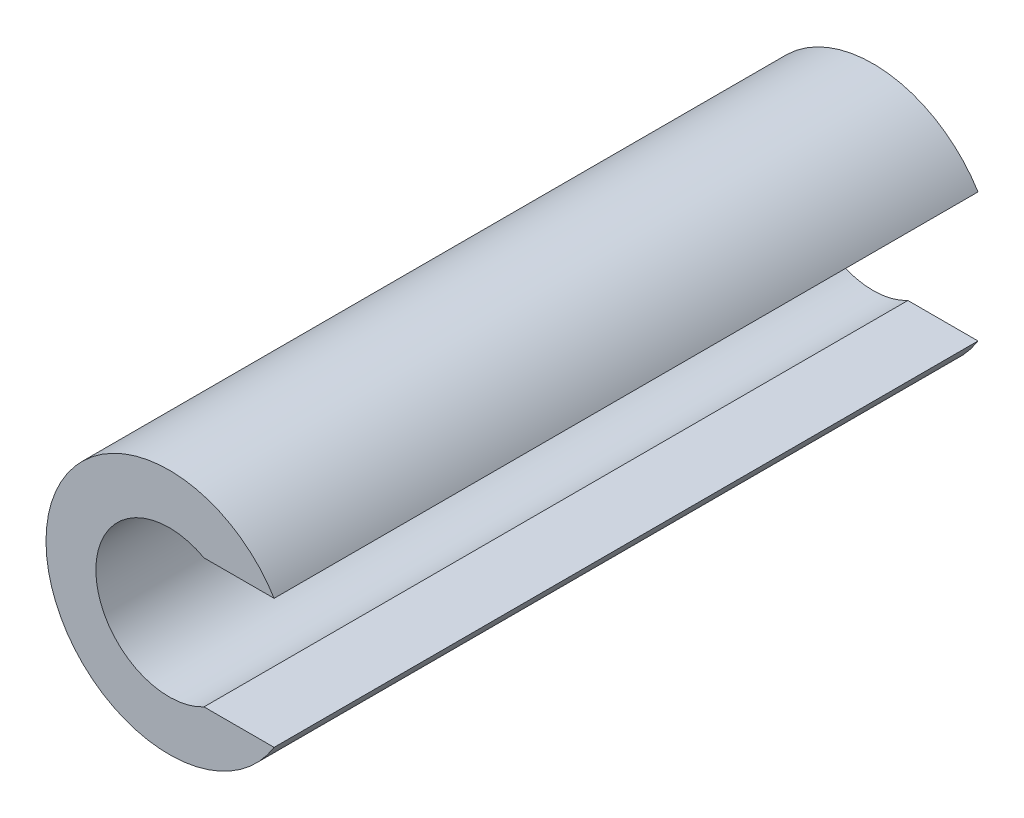
ISO-10303-21;
HEADER;
FILE_DESCRIPTION(('STEP AP214'),'2;1');
FILE_NAME('part.step','',(''),(''),'','','');
FILE_SCHEMA(('AUTOMOTIVE_DESIGN { 1 0 10303 214 1 1 1 1 }'));
ENDSEC;
DATA;
#1=APPLICATION_CONTEXT('core data for automotive mechanical design processes');
#2=APPLICATION_PROTOCOL_DEFINITION('international standard','automotive_design',2000,#1);
#3=PRODUCT_CONTEXT('',#1,'mechanical');
#4=PRODUCT('Part','Part','',(#3));
#5=PRODUCT_RELATED_PRODUCT_CATEGORY('part','',(#4));
#6=PRODUCT_DEFINITION_FORMATION('','',#4);
#7=PRODUCT_DEFINITION_CONTEXT('part definition',#1,'design');
#8=PRODUCT_DEFINITION('design','',#6,#7);
#9=PRODUCT_DEFINITION_SHAPE('','',#8);
#10=(LENGTH_UNIT() NAMED_UNIT(*) SI_UNIT(.MILLI.,.METRE.));
#11=(NAMED_UNIT(*) PLANE_ANGLE_UNIT() SI_UNIT($,.RADIAN.));
#12=(NAMED_UNIT(*) SI_UNIT($,.STERADIAN.) SOLID_ANGLE_UNIT());
#13=UNCERTAINTY_MEASURE_WITH_UNIT(LENGTH_MEASURE(1.E-05),#10,'distance_accuracy_value','');
#14=(GEOMETRIC_REPRESENTATION_CONTEXT(3) GLOBAL_UNCERTAINTY_ASSIGNED_CONTEXT((#13)) GLOBAL_UNIT_ASSIGNED_CONTEXT((#10,
#11,#12)) REPRESENTATION_CONTEXT('',''));
#15=CARTESIAN_POINT('',(0.,0.,0.));
#16=DIRECTION('',(0.,0.,1.));
#17=DIRECTION('',(1.,0.,0.));
#18=AXIS2_PLACEMENT_3D('',#15,#16,#17);
#19=CARTESIAN_POINT('',(0.,0.,60.));
#20=DIRECTION('',(0.,0.,1.));
#21=DIRECTION('',(1.,0.,0.));
#22=AXIS2_PLACEMENT_3D('',#19,#20,#21);
#23=PLANE('',#22);
#24=DIRECTION('',(1.,0.,0.));
#25=VECTOR('',#24,1.);
#26=CARTESIAN_POINT('',(0.,-5.5,60.));
#27=LINE('',#26,#25);
#28=CARTESIAN_POINT('',(2.96858552175948,-5.5,60.));
#29=VERTEX_POINT('',#28);
#30=CARTESIAN_POINT('',(8.94427190999916,-5.5,60.));
#31=VERTEX_POINT('',#30);
#32=EDGE_CURVE('E105',#29,#31,#27,.T.);
#33=ORIENTED_EDGE('',*,*,#32,.F.);
#34=CARTESIAN_POINT('',(0.,0.,60.));
#35=DIRECTION('',(0.,0.,1.));
#36=DIRECTION('',(1.,0.,0.));
#37=AXIS2_PLACEMENT_3D('',#34,#35,#36);
#38=CIRCLE('',#37,6.25);
#39=CARTESIAN_POINT('',(2.96858552175948,5.5,60.));
#40=VERTEX_POINT('',#39);
#41=EDGE_CURVE('E93',#40,#29,#38,.T.);
#42=ORIENTED_EDGE('',*,*,#41,.F.);
#43=DIRECTION('',(-1.,0.,0.));
#44=VECTOR('',#43,1.);
#45=CARTESIAN_POINT('',(12.,5.5,60.));
#46=LINE('',#45,#44);
#47=CARTESIAN_POINT('',(8.94427190999916,5.5,60.));
#48=VERTEX_POINT('',#47);
#49=EDGE_CURVE('E80',#48,#40,#46,.T.);
#50=ORIENTED_EDGE('',*,*,#49,.F.);
#51=CARTESIAN_POINT('',(0.,0.,60.));
#52=DIRECTION('',(0.,0.,1.));
#53=DIRECTION('',(1.,0.,0.));
#54=AXIS2_PLACEMENT_3D('',#51,#52,#53);
#55=CIRCLE('',#54,10.5);
#56=EDGE_CURVE('E99',#48,#31,#55,.T.);
#57=ORIENTED_EDGE('',*,*,#56,.T.);
#58=EDGE_LOOP('',(#33,#42,#50,#57));
#59=FACE_BOUND('',#58,.T.);
#60=ADVANCED_FACE('F43',(#59),#23,.T.);
#61=CARTESIAN_POINT('',(0.,0.,0.));
#62=DIRECTION('',(0.,0.,1.));
#63=DIRECTION('',(1.,0.,0.));
#64=AXIS2_PLACEMENT_3D('',#61,#62,#63);
#65=PLANE('',#64);
#66=CARTESIAN_POINT('',(0.,0.,0.));
#67=DIRECTION('',(0.,0.,1.));
#68=DIRECTION('',(1.,0.,0.));
#69=AXIS2_PLACEMENT_3D('',#66,#67,#68);
#70=CIRCLE('',#69,10.5);
#71=CARTESIAN_POINT('',(8.94427190999916,5.5,0.));
#72=VERTEX_POINT('',#71);
#73=CARTESIAN_POINT('',(8.94427190999916,-5.5,0.));
#74=VERTEX_POINT('',#73);
#75=EDGE_CURVE('E89',#72,#74,#70,.T.);
#76=ORIENTED_EDGE('',*,*,#75,.F.);
#77=DIRECTION('',(1.,0.,0.));
#78=VECTOR('',#77,1.);
#79=CARTESIAN_POINT('',(0.,5.5,0.));
#80=LINE('',#79,#78);
#81=CARTESIAN_POINT('',(2.96858552175948,5.5,0.));
#82=VERTEX_POINT('',#81);
#83=EDGE_CURVE('E50',#72,#82,#80,.F.);
#84=ORIENTED_EDGE('',*,*,#83,.T.);
#85=CARTESIAN_POINT('',(0.,0.,0.));
#86=DIRECTION('',(0.,0.,1.));
#87=DIRECTION('',(1.,0.,0.));
#88=AXIS2_PLACEMENT_3D('',#85,#86,#87);
#89=CIRCLE('',#88,6.25);
#90=CARTESIAN_POINT('',(2.96858552175948,-5.5,0.));
#91=VERTEX_POINT('',#90);
#92=EDGE_CURVE('E88',#82,#91,#89,.T.);
#93=ORIENTED_EDGE('',*,*,#92,.T.);
#94=DIRECTION('',(1.,0.,0.));
#95=VECTOR('',#94,1.);
#96=CARTESIAN_POINT('',(0.,-5.5,0.));
#97=LINE('',#96,#95);
#98=EDGE_CURVE('E65',#91,#74,#97,.T.);
#99=ORIENTED_EDGE('',*,*,#98,.T.);
#100=EDGE_LOOP('',(#76,#84,#93,#99));
#101=FACE_BOUND('',#100,.T.);
#102=ADVANCED_FACE('F90',(#101),#65,.F.);
#103=CARTESIAN_POINT('',(0.,0.,60.));
#104=DIRECTION('',(0.,0.,-1.));
#105=DIRECTION('',(-1.,0.,0.));
#106=AXIS2_PLACEMENT_3D('',#103,#104,#105);
#107=CYLINDRICAL_SURFACE('',#106,10.5);
#108=ORIENTED_EDGE('',*,*,#56,.F.);
#109=DIRECTION('',(0.,0.,-1.));
#110=VECTOR('',#109,1.);
#111=CARTESIAN_POINT('',(8.94427190999916,5.5,60.));
#112=LINE('',#111,#110);
#113=EDGE_CURVE('E92',#48,#72,#112,.T.);
#114=ORIENTED_EDGE('',*,*,#113,.T.);
#115=ORIENTED_EDGE('',*,*,#75,.T.);
#116=DIRECTION('',(0.,0.,-1.));
#117=VECTOR('',#116,1.);
#118=CARTESIAN_POINT('',(8.94427190999916,-5.5,60.));
#119=LINE('',#118,#117);
#120=EDGE_CURVE('E91',#74,#31,#119,.F.);
#121=ORIENTED_EDGE('',*,*,#120,.T.);
#122=EDGE_LOOP('',(#108,#114,#115,#121));
#123=FACE_BOUND('',#122,.T.);
#124=ADVANCED_FACE('F44',(#123),#107,.T.);
#125=CARTESIAN_POINT('',(0.,0.,60.));
#126=DIRECTION('',(0.,0.,-1.));
#127=DIRECTION('',(-1.,0.,0.));
#128=AXIS2_PLACEMENT_3D('',#125,#126,#127);
#129=CYLINDRICAL_SURFACE('',#128,6.25);
#130=DIRECTION('',(0.,0.,-1.));
#131=VECTOR('',#130,1.);
#132=CARTESIAN_POINT('',(2.96858552175948,5.5,60.));
#133=LINE('',#132,#131);
#134=EDGE_CURVE('E11',#40,#82,#133,.T.);
#135=ORIENTED_EDGE('',*,*,#134,.F.);
#136=ORIENTED_EDGE('',*,*,#41,.T.);
#137=DIRECTION('',(0.,0.,-1.));
#138=VECTOR('',#137,1.);
#139=CARTESIAN_POINT('',(2.96858552175948,-5.5,60.));
#140=LINE('',#139,#138);
#141=EDGE_CURVE('E52',#91,#29,#140,.F.);
#142=ORIENTED_EDGE('',*,*,#141,.F.);
#143=ORIENTED_EDGE('',*,*,#92,.F.);
#144=EDGE_LOOP('',(#135,#136,#142,#143));
#145=FACE_BOUND('',#144,.T.);
#146=ADVANCED_FACE('F95',(#145),#129,.F.);
#147=CARTESIAN_POINT('',(0.,-5.5,-1.2E-05));
#148=DIRECTION('',(0.,-1.,0.));
#149=DIRECTION('',(0.,0.,-1.));
#150=AXIS2_PLACEMENT_3D('',#147,#148,#149);
#151=PLANE('',#150);
#152=ORIENTED_EDGE('',*,*,#98,.F.);
#153=ORIENTED_EDGE('',*,*,#141,.T.);
#154=ORIENTED_EDGE('',*,*,#32,.T.);
#155=ORIENTED_EDGE('',*,*,#120,.F.);
#156=EDGE_LOOP('',(#152,#153,#154,#155));
#157=FACE_BOUND('',#156,.T.);
#158=ADVANCED_FACE('F120',(#157),#151,.F.);
#159=CARTESIAN_POINT('',(12.,5.5,-1.2E-05));
#160=DIRECTION('',(0.,1.,0.));
#161=DIRECTION('',(0.,0.,1.));
#162=AXIS2_PLACEMENT_3D('',#159,#160,#161);
#163=PLANE('',#162);
#164=ORIENTED_EDGE('',*,*,#49,.T.);
#165=ORIENTED_EDGE('',*,*,#134,.T.);
#166=ORIENTED_EDGE('',*,*,#83,.F.);
#167=ORIENTED_EDGE('',*,*,#113,.F.);
#168=EDGE_LOOP('',(#164,#165,#166,#167));
#169=FACE_BOUND('',#168,.T.);
#170=ADVANCED_FACE('F77',(#169),#163,.F.);
#171=CLOSED_SHELL('',(#60,#102,#124,#146,#158,#170));
#172=MANIFOLD_SOLID_BREP('B2',#171);
#173=ADVANCED_BREP_SHAPE_REPRESENTATION('',(#18,#172),#14);
#174=SHAPE_DEFINITION_REPRESENTATION(#9,#173);
ENDSEC;
END-ISO-10303-21;
